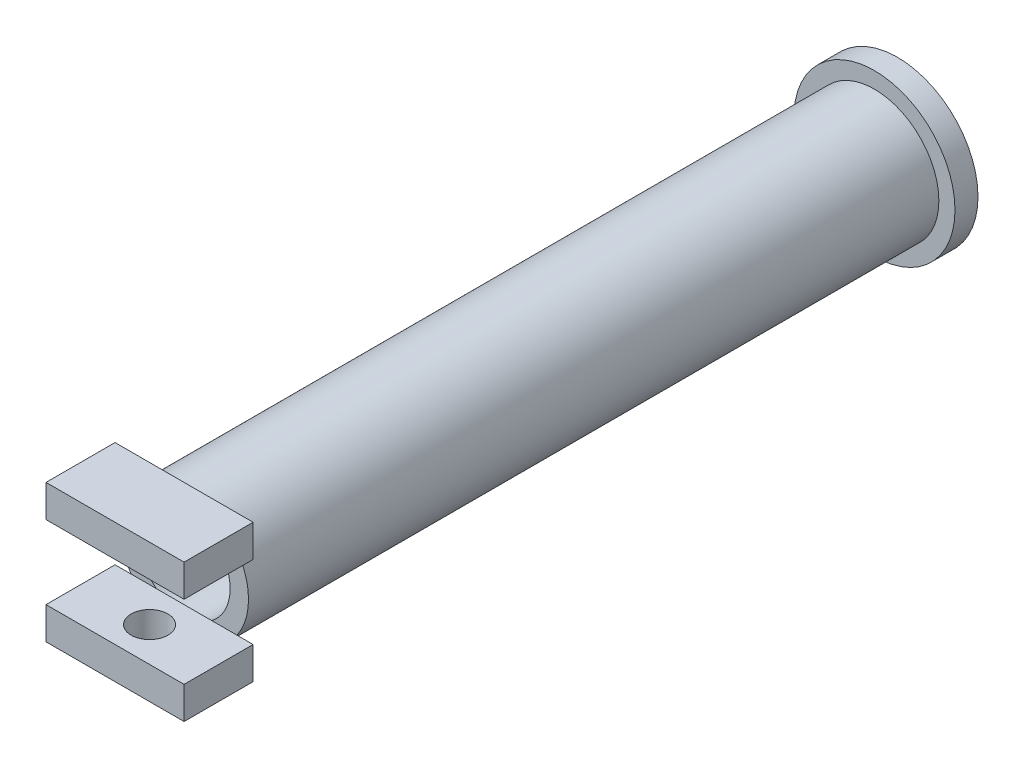
ISO-10303-21;
HEADER;
FILE_DESCRIPTION(('STEP AP214'),'2;1');
FILE_NAME('part.step','',(''),(''),'','','');
FILE_SCHEMA(('AUTOMOTIVE_DESIGN { 1 0 10303 214 1 1 1 1 }'));
ENDSEC;
DATA;
#1=APPLICATION_CONTEXT('core data for automotive mechanical design processes');
#2=APPLICATION_PROTOCOL_DEFINITION('international standard','automotive_design',2000,#1);
#3=PRODUCT_CONTEXT('',#1,'mechanical');
#4=PRODUCT('Part','Part','',(#3));
#5=PRODUCT_RELATED_PRODUCT_CATEGORY('part','',(#4));
#6=PRODUCT_DEFINITION_FORMATION('','',#4);
#7=PRODUCT_DEFINITION_CONTEXT('part definition',#1,'design');
#8=PRODUCT_DEFINITION('design','',#6,#7);
#9=PRODUCT_DEFINITION_SHAPE('','',#8);
#10=(LENGTH_UNIT() NAMED_UNIT(*) SI_UNIT(.MILLI.,.METRE.));
#11=(NAMED_UNIT(*) PLANE_ANGLE_UNIT() SI_UNIT($,.RADIAN.));
#12=(NAMED_UNIT(*) SI_UNIT($,.STERADIAN.) SOLID_ANGLE_UNIT());
#13=UNCERTAINTY_MEASURE_WITH_UNIT(LENGTH_MEASURE(1.E-05),#10,'distance_accuracy_value','');
#14=(GEOMETRIC_REPRESENTATION_CONTEXT(3) GLOBAL_UNCERTAINTY_ASSIGNED_CONTEXT((#13)) GLOBAL_UNIT_ASSIGNED_CONTEXT((#10,
#11,#12)) REPRESENTATION_CONTEXT('',''));
#15=CARTESIAN_POINT('',(0.,0.,0.));
#16=DIRECTION('',(0.,0.,1.));
#17=DIRECTION('',(1.,0.,0.));
#18=AXIS2_PLACEMENT_3D('',#15,#16,#17);
#19=CARTESIAN_POINT('',(0.,0.,170.));
#20=DIRECTION('',(0.,0.,-1.));
#21=DIRECTION('',(-1.,0.,0.));
#22=AXIS2_PLACEMENT_3D('',#19,#20,#21);
#23=PLANE('',#22);
#24=DIRECTION('',(-1.,0.,0.));
#25=VECTOR('',#24,1.);
#26=CARTESIAN_POINT('',(-15.,8.,170.));
#27=LINE('',#26,#25);
#28=CARTESIAN_POINT('',(15.,8.,170.));
#29=VERTEX_POINT('',#28);
#30=CARTESIAN_POINT('',(-15.,8.,170.));
#31=VERTEX_POINT('',#30);
#32=EDGE_CURVE('E133',#29,#31,#27,.T.);
#33=ORIENTED_EDGE('',*,*,#32,.F.);
#34=DIRECTION('',(0.,1.,0.));
#35=VECTOR('',#34,1.);
#36=CARTESIAN_POINT('',(15.,-15.,170.));
#37=LINE('',#36,#35);
#38=CARTESIAN_POINT('',(15.,15.,170.));
#39=VERTEX_POINT('',#38);
#40=EDGE_CURVE('E161',#29,#39,#37,.T.);
#41=ORIENTED_EDGE('',*,*,#40,.T.);
#42=DIRECTION('',(-1.,0.,0.));
#43=VECTOR('',#42,1.);
#44=CARTESIAN_POINT('',(-15.,15.,170.));
#45=LINE('',#44,#43);
#46=CARTESIAN_POINT('',(-15.,15.,170.));
#47=VERTEX_POINT('',#46);
#48=EDGE_CURVE('E288',#39,#47,#45,.T.);
#49=ORIENTED_EDGE('',*,*,#48,.T.);
#50=DIRECTION('',(0.,-1.,0.));
#51=VECTOR('',#50,1.);
#52=CARTESIAN_POINT('',(-15.,-15.,170.));
#53=LINE('',#52,#51);
#54=EDGE_CURVE('E290',#47,#31,#53,.T.);
#55=ORIENTED_EDGE('',*,*,#54,.T.);
#56=EDGE_LOOP('',(#33,#41,#49,#55));
#57=FACE_BOUND('',#56,.T.);
#58=ADVANCED_FACE('F39',(#57),#23,.F.);
#59=DIRECTION('',(1.,0.,0.));
#60=VECTOR('',#59,1.);
#61=CARTESIAN_POINT('',(-15.,-8.,170.));
#62=LINE('',#61,#60);
#63=CARTESIAN_POINT('',(-15.,-8.,170.));
#64=VERTEX_POINT('',#63);
#65=CARTESIAN_POINT('',(15.,-8.,170.));
#66=VERTEX_POINT('',#65);
#67=EDGE_CURVE('E267',#64,#66,#62,.T.);
#68=ORIENTED_EDGE('',*,*,#67,.F.);
#69=CARTESIAN_POINT('',(-15.,-15.,170.));
#70=VERTEX_POINT('',#69);
#71=EDGE_CURVE('E287',#64,#70,#53,.T.);
#72=ORIENTED_EDGE('',*,*,#71,.T.);
#73=DIRECTION('',(1.,0.,0.));
#74=VECTOR('',#73,1.);
#75=CARTESIAN_POINT('',(-15.,-15.,170.));
#76=LINE('',#75,#74);
#77=CARTESIAN_POINT('',(15.,-15.,170.));
#78=VERTEX_POINT('',#77);
#79=EDGE_CURVE('E171',#70,#78,#76,.T.);
#80=ORIENTED_EDGE('',*,*,#79,.T.);
#81=EDGE_CURVE('E284',#78,#66,#37,.T.);
#82=ORIENTED_EDGE('',*,*,#81,.T.);
#83=EDGE_LOOP('',(#68,#72,#80,#82));
#84=FACE_BOUND('',#83,.T.);
#85=ADVANCED_FACE('F213',(#84),#23,.F.);
#86=CARTESIAN_POINT('',(-15.,-15.,170.));
#87=DIRECTION('',(1.,0.,0.));
#88=DIRECTION('',(0.,0.,-1.));
#89=AXIS2_PLACEMENT_3D('',#86,#87,#88);
#90=PLANE('',#89);
#91=DIRECTION('',(0.,0.,1.));
#92=VECTOR('',#91,1.);
#93=CARTESIAN_POINT('',(-15.,-8.,155.));
#94=LINE('',#93,#92);
#95=CARTESIAN_POINT('',(-15.,-8.,155.));
#96=VERTEX_POINT('',#95);
#97=EDGE_CURVE('E140',#96,#64,#94,.T.);
#98=ORIENTED_EDGE('',*,*,#97,.F.);
#99=DIRECTION('',(0.,-1.,0.));
#100=VECTOR('',#99,1.);
#101=CARTESIAN_POINT('',(-15.,-15.,155.));
#102=LINE('',#101,#100);
#103=CARTESIAN_POINT('',(-15.,-15.,155.));
#104=VERTEX_POINT('',#103);
#105=EDGE_CURVE('E157',#96,#104,#102,.T.);
#106=ORIENTED_EDGE('',*,*,#105,.T.);
#107=DIRECTION('',(0.,0.,-1.));
#108=VECTOR('',#107,1.);
#109=CARTESIAN_POINT('',(-15.,-15.,170.));
#110=LINE('',#109,#108);
#111=EDGE_CURVE('E168',#70,#104,#110,.T.);
#112=ORIENTED_EDGE('',*,*,#111,.F.);
#113=ORIENTED_EDGE('',*,*,#71,.F.);
#114=EDGE_LOOP('',(#98,#106,#112,#113));
#115=FACE_BOUND('',#114,.T.);
#116=ADVANCED_FACE('F219',(#115),#90,.F.);
#117=CARTESIAN_POINT('',(15.,-15.,170.));
#118=DIRECTION('',(-1.,0.,0.));
#119=DIRECTION('',(0.,0.,1.));
#120=AXIS2_PLACEMENT_3D('',#117,#118,#119);
#121=PLANE('',#120);
#122=DIRECTION('',(0.,0.,1.));
#123=VECTOR('',#122,1.);
#124=CARTESIAN_POINT('',(15.,8.,155.));
#125=LINE('',#124,#123);
#126=CARTESIAN_POINT('',(15.,8.,155.));
#127=VERTEX_POINT('',#126);
#128=EDGE_CURVE('E136',#127,#29,#125,.T.);
#129=ORIENTED_EDGE('',*,*,#128,.F.);
#130=DIRECTION('',(0.,1.,0.));
#131=VECTOR('',#130,1.);
#132=CARTESIAN_POINT('',(15.,-15.,155.));
#133=LINE('',#132,#131);
#134=CARTESIAN_POINT('',(15.,15.,155.));
#135=VERTEX_POINT('',#134);
#136=EDGE_CURVE('E291',#127,#135,#133,.T.);
#137=ORIENTED_EDGE('',*,*,#136,.T.);
#138=DIRECTION('',(0.,0.,-1.));
#139=VECTOR('',#138,1.);
#140=CARTESIAN_POINT('',(15.,15.,170.));
#141=LINE('',#140,#139);
#142=EDGE_CURVE('E175',#39,#135,#141,.T.);
#143=ORIENTED_EDGE('',*,*,#142,.F.);
#144=ORIENTED_EDGE('',*,*,#40,.F.);
#145=EDGE_LOOP('',(#129,#137,#143,#144));
#146=FACE_BOUND('',#145,.T.);
#147=ADVANCED_FACE('F244',(#146),#121,.F.);
#148=CARTESIAN_POINT('',(0.,0.,155.));
#149=DIRECTION('',(0.,0.,-1.));
#150=DIRECTION('',(-1.,0.,0.));
#151=AXIS2_PLACEMENT_3D('',#148,#149,#150);
#152=PLANE('',#151);
#153=ORIENTED_EDGE('',*,*,#105,.F.);
#154=DIRECTION('',(1.,0.,0.));
#155=VECTOR('',#154,1.);
#156=CARTESIAN_POINT('',(-15.,-8.,155.));
#157=LINE('',#156,#155);
#158=CARTESIAN_POINT('',(-11.4891252930761,-8.,155.));
#159=VERTEX_POINT('',#158);
#160=EDGE_CURVE('E49',#96,#159,#157,.T.);
#161=ORIENTED_EDGE('',*,*,#160,.T.);
#162=CARTESIAN_POINT('',(0.,0.,155.));
#163=DIRECTION('',(0.,0.,1.));
#164=DIRECTION('',(1.,0.,0.));
#165=AXIS2_PLACEMENT_3D('',#162,#163,#164);
#166=CIRCLE('',#165,14.);
#167=CARTESIAN_POINT('',(11.4891252930761,-8.,155.));
#168=VERTEX_POINT('',#167);
#169=EDGE_CURVE('E315',#159,#168,#166,.T.);
#170=ORIENTED_EDGE('',*,*,#169,.T.);
#171=CARTESIAN_POINT('',(15.,-8.,155.));
#172=VERTEX_POINT('',#171);
#173=EDGE_CURVE('E11',#168,#172,#157,.T.);
#174=ORIENTED_EDGE('',*,*,#173,.T.);
#175=CARTESIAN_POINT('',(15.,-15.,155.));
#176=VERTEX_POINT('',#175);
#177=EDGE_CURVE('E292',#176,#172,#133,.T.);
#178=ORIENTED_EDGE('',*,*,#177,.F.);
#179=DIRECTION('',(1.,0.,0.));
#180=VECTOR('',#179,1.);
#181=CARTESIAN_POINT('',(-15.,-15.,155.));
#182=LINE('',#181,#180);
#183=EDGE_CURVE('E158',#104,#176,#182,.T.);
#184=ORIENTED_EDGE('',*,*,#183,.F.);
#185=EDGE_LOOP('',(#153,#161,#170,#174,#178,#184));
#186=FACE_BOUND('',#185,.T.);
#187=ADVANCED_FACE('F312',(#186),#152,.T.);
#188=ORIENTED_EDGE('',*,*,#136,.F.);
#189=DIRECTION('',(-1.,0.,0.));
#190=VECTOR('',#189,1.);
#191=CARTESIAN_POINT('',(-15.,8.,155.));
#192=LINE('',#191,#190);
#193=CARTESIAN_POINT('',(11.4891252930761,8.,155.));
#194=VERTEX_POINT('',#193);
#195=EDGE_CURVE('E65',#127,#194,#192,.T.);
#196=ORIENTED_EDGE('',*,*,#195,.T.);
#197=CARTESIAN_POINT('',(-11.4891252930761,8.,155.));
#198=VERTEX_POINT('',#197);
#199=EDGE_CURVE('E147',#194,#198,#166,.T.);
#200=ORIENTED_EDGE('',*,*,#199,.T.);
#201=CARTESIAN_POINT('',(-15.,8.,155.));
#202=VERTEX_POINT('',#201);
#203=EDGE_CURVE('E48',#198,#202,#192,.T.);
#204=ORIENTED_EDGE('',*,*,#203,.T.);
#205=CARTESIAN_POINT('',(-15.,15.,155.));
#206=VERTEX_POINT('',#205);
#207=EDGE_CURVE('E146',#206,#202,#102,.T.);
#208=ORIENTED_EDGE('',*,*,#207,.F.);
#209=DIRECTION('',(-1.,0.,0.));
#210=VECTOR('',#209,1.);
#211=CARTESIAN_POINT('',(-15.,15.,155.));
#212=LINE('',#211,#210);
#213=EDGE_CURVE('E162',#135,#206,#212,.T.);
#214=ORIENTED_EDGE('',*,*,#213,.F.);
#215=EDGE_LOOP('',(#188,#196,#200,#204,#208,#214));
#216=FACE_BOUND('',#215,.T.);
#217=ADVANCED_FACE('F148',(#216),#152,.T.);
#218=CARTESIAN_POINT('',(0.,0.,5.));
#219=DIRECTION('',(0.,0.,-1.));
#220=DIRECTION('',(-1.,0.,0.));
#221=AXIS2_PLACEMENT_3D('',#218,#219,#220);
#222=CYLINDRICAL_SURFACE('',#221,17.5);
#223=CARTESIAN_POINT('',(0.,0.,5.));
#224=DIRECTION('',(0.,0.,1.));
#225=DIRECTION('',(1.,0.,0.));
#226=AXIS2_PLACEMENT_3D('',#223,#224,#225);
#227=CIRCLE('',#226,17.5);
#228=CARTESIAN_POINT('',(17.5,0.,5.));
#229=VERTEX_POINT('',#228);
#230=EDGE_CURVE('E151',#229,#229,#227,.T.);
#231=ORIENTED_EDGE('',*,*,#230,.F.);
#232=EDGE_LOOP('',(#231));
#233=FACE_BOUND('',#232,.T.);
#234=CARTESIAN_POINT('',(0.,0.,0.));
#235=DIRECTION('',(0.,0.,1.));
#236=DIRECTION('',(1.,0.,0.));
#237=AXIS2_PLACEMENT_3D('',#234,#235,#236);
#238=CIRCLE('',#237,17.5);
#239=CARTESIAN_POINT('',(17.5,0.,0.));
#240=VERTEX_POINT('',#239);
#241=EDGE_CURVE('E194',#240,#240,#238,.T.);
#242=ORIENTED_EDGE('',*,*,#241,.T.);
#243=EDGE_LOOP('',(#242));
#244=FACE_BOUND('',#243,.T.);
#245=ADVANCED_FACE('F41',(#233,#244),#222,.T.);
#246=CARTESIAN_POINT('',(0.,0.,5.));
#247=DIRECTION('',(0.,0.,1.));
#248=DIRECTION('',(1.,0.,0.));
#249=AXIS2_PLACEMENT_3D('',#246,#247,#248);
#250=PLANE('',#249);
#251=CARTESIAN_POINT('',(0.,0.,5.));
#252=DIRECTION('',(0.,0.,1.));
#253=DIRECTION('',(1.,0.,0.));
#254=AXIS2_PLACEMENT_3D('',#251,#252,#253);
#255=CIRCLE('',#254,14.);
#256=CARTESIAN_POINT('',(14.,0.,5.));
#257=VERTEX_POINT('',#256);
#258=EDGE_CURVE('E189',#257,#257,#255,.F.);
#259=ORIENTED_EDGE('',*,*,#258,.T.);
#260=EDGE_LOOP('',(#259));
#261=FACE_BOUND('',#260,.T.);
#262=ORIENTED_EDGE('',*,*,#230,.T.);
#263=EDGE_LOOP('',(#262));
#264=FACE_BOUND('',#263,.T.);
#265=ADVANCED_FACE('F203',(#261,#264),#250,.T.);
#266=CARTESIAN_POINT('',(0.,0.,0.));
#267=DIRECTION('',(0.,0.,1.));
#268=DIRECTION('',(1.,0.,0.));
#269=AXIS2_PLACEMENT_3D('',#266,#267,#268);
#270=PLANE('',#269);
#271=ORIENTED_EDGE('',*,*,#241,.F.);
#272=EDGE_LOOP('',(#271));
#273=FACE_BOUND('',#272,.T.);
#274=ADVANCED_FACE('F196',(#273),#270,.F.);
#275=CARTESIAN_POINT('',(0.,0.,155.));
#276=DIRECTION('',(0.,0.,-1.));
#277=DIRECTION('',(-1.,0.,0.));
#278=AXIS2_PLACEMENT_3D('',#275,#276,#277);
#279=CYLINDRICAL_SURFACE('',#278,14.);
#280=ORIENTED_EDGE('',*,*,#258,.F.);
#281=EDGE_LOOP('',(#280));
#282=FACE_BOUND('',#281,.T.);
#283=ORIENTED_EDGE('',*,*,#199,.F.);
#284=EDGE_CURVE('E185',#168,#194,#166,.T.);
#285=ORIENTED_EDGE('',*,*,#284,.F.);
#286=ORIENTED_EDGE('',*,*,#169,.F.);
#287=EDGE_CURVE('E188',#198,#159,#166,.T.);
#288=ORIENTED_EDGE('',*,*,#287,.F.);
#289=EDGE_LOOP('',(#283,#285,#286,#288));
#290=FACE_BOUND('',#289,.T.);
#291=ADVANCED_FACE('F199',(#282,#290),#279,.T.);
#292=CARTESIAN_POINT('',(-15.,-15.,170.));
#293=DIRECTION('',(0.,1.,0.));
#294=DIRECTION('',(0.,0.,1.));
#295=AXIS2_PLACEMENT_3D('',#292,#293,#294);
#296=PLANE('',#295);
#297=CARTESIAN_POINT('',(0.,-15.,162.5));
#298=DIRECTION('',(0.,1.,0.));
#299=DIRECTION('',(0.,0.,1.));
#300=AXIS2_PLACEMENT_3D('',#297,#298,#299);
#301=CIRCLE('',#300,4.);
#302=CARTESIAN_POINT('',(0.,-15.,166.5));
#303=VERTEX_POINT('',#302);
#304=EDGE_CURVE('E275',#303,#303,#301,.T.);
#305=ORIENTED_EDGE('',*,*,#304,.T.);
#306=EDGE_LOOP('',(#305));
#307=FACE_BOUND('',#306,.T.);
#308=ORIENTED_EDGE('',*,*,#183,.T.);
#309=DIRECTION('',(0.,0.,-1.));
#310=VECTOR('',#309,1.);
#311=CARTESIAN_POINT('',(15.,-15.,170.));
#312=LINE('',#311,#310);
#313=EDGE_CURVE('E170',#78,#176,#312,.T.);
#314=ORIENTED_EDGE('',*,*,#313,.F.);
#315=ORIENTED_EDGE('',*,*,#79,.F.);
#316=ORIENTED_EDGE('',*,*,#111,.T.);
#317=EDGE_LOOP('',(#308,#314,#315,#316));
#318=FACE_BOUND('',#317,.T.);
#319=ADVANCED_FACE('F210',(#307,#318),#296,.F.);
#320=ORIENTED_EDGE('',*,*,#207,.T.);
#321=DIRECTION('',(0.,0.,1.));
#322=VECTOR('',#321,1.);
#323=CARTESIAN_POINT('',(-15.,8.,155.));
#324=LINE('',#323,#322);
#325=EDGE_CURVE('E128',#202,#31,#324,.T.);
#326=ORIENTED_EDGE('',*,*,#325,.T.);
#327=ORIENTED_EDGE('',*,*,#54,.F.);
#328=DIRECTION('',(0.,0.,-1.));
#329=VECTOR('',#328,1.);
#330=CARTESIAN_POINT('',(-15.,15.,170.));
#331=LINE('',#330,#329);
#332=EDGE_CURVE('E160',#47,#206,#331,.T.);
#333=ORIENTED_EDGE('',*,*,#332,.T.);
#334=EDGE_LOOP('',(#320,#326,#327,#333));
#335=FACE_BOUND('',#334,.T.);
#336=ADVANCED_FACE('F154',(#335),#90,.F.);
#337=CARTESIAN_POINT('',(-15.,15.,170.));
#338=DIRECTION('',(0.,-1.,0.));
#339=DIRECTION('',(0.,0.,-1.));
#340=AXIS2_PLACEMENT_3D('',#337,#338,#339);
#341=PLANE('',#340);
#342=ORIENTED_EDGE('',*,*,#213,.T.);
#343=ORIENTED_EDGE('',*,*,#332,.F.);
#344=ORIENTED_EDGE('',*,*,#48,.F.);
#345=ORIENTED_EDGE('',*,*,#142,.T.);
#346=EDGE_LOOP('',(#342,#343,#344,#345));
#347=FACE_BOUND('',#346,.T.);
#348=ADVANCED_FACE('F231',(#347),#341,.F.);
#349=ORIENTED_EDGE('',*,*,#177,.T.);
#350=DIRECTION('',(0.,0.,1.));
#351=VECTOR('',#350,1.);
#352=CARTESIAN_POINT('',(15.,-8.,155.));
#353=LINE('',#352,#351);
#354=EDGE_CURVE('E279',#172,#66,#353,.T.);
#355=ORIENTED_EDGE('',*,*,#354,.T.);
#356=ORIENTED_EDGE('',*,*,#81,.F.);
#357=ORIENTED_EDGE('',*,*,#313,.T.);
#358=EDGE_LOOP('',(#349,#355,#356,#357));
#359=FACE_BOUND('',#358,.T.);
#360=ADVANCED_FACE('F240',(#359),#121,.F.);
#361=CARTESIAN_POINT('',(0.,0.,155.));
#362=DIRECTION('',(0.,0.,-1.));
#363=DIRECTION('',(-1.,0.,0.));
#364=AXIS2_PLACEMENT_3D('',#361,#362,#363);
#365=PLANE('',#364);
#366=CARTESIAN_POINT('',(-6.,8.,155.));
#367=VERTEX_POINT('',#366);
#368=EDGE_CURVE('E59',#367,#198,#192,.T.);
#369=ORIENTED_EDGE('',*,*,#368,.T.);
#370=ORIENTED_EDGE('',*,*,#287,.T.);
#371=CARTESIAN_POINT('',(-6.,-8.,155.));
#372=VERTEX_POINT('',#371);
#373=EDGE_CURVE('E51',#159,#372,#157,.T.);
#374=ORIENTED_EDGE('',*,*,#373,.T.);
#375=CARTESIAN_POINT('',(0.,0.,155.));
#376=DIRECTION('',(0.,0.,1.));
#377=DIRECTION('',(1.,0.,0.));
#378=AXIS2_PLACEMENT_3D('',#375,#376,#377);
#379=CIRCLE('',#378,10.);
#380=EDGE_CURVE('E262',#367,#372,#379,.T.);
#381=ORIENTED_EDGE('',*,*,#380,.F.);
#382=EDGE_LOOP('',(#369,#370,#374,#381));
#383=FACE_BOUND('',#382,.T.);
#384=ADVANCED_FACE('F241',(#383),#365,.F.);
#385=CARTESIAN_POINT('',(6.,-8.,155.));
#386=VERTEX_POINT('',#385);
#387=EDGE_CURVE('E271',#386,#168,#157,.T.);
#388=ORIENTED_EDGE('',*,*,#387,.T.);
#389=ORIENTED_EDGE('',*,*,#284,.T.);
#390=CARTESIAN_POINT('',(6.,8.,155.));
#391=VERTEX_POINT('',#390);
#392=EDGE_CURVE('E153',#194,#391,#192,.T.);
#393=ORIENTED_EDGE('',*,*,#392,.T.);
#394=EDGE_CURVE('E186',#386,#391,#379,.T.);
#395=ORIENTED_EDGE('',*,*,#394,.F.);
#396=EDGE_LOOP('',(#388,#389,#393,#395));
#397=FACE_BOUND('',#396,.T.);
#398=ADVANCED_FACE('F307',(#397),#365,.F.);
#399=CARTESIAN_POINT('',(-15.,-8.,155.));
#400=DIRECTION('',(0.,-1.,0.));
#401=DIRECTION('',(0.,0.,-1.));
#402=AXIS2_PLACEMENT_3D('',#399,#400,#401);
#403=PLANE('',#402);
#404=CARTESIAN_POINT('',(0.,-8.,162.5));
#405=DIRECTION('',(0.,-1.,0.));
#406=DIRECTION('',(0.,0.,-1.));
#407=AXIS2_PLACEMENT_3D('',#404,#405,#406);
#408=CIRCLE('',#407,4.);
#409=CARTESIAN_POINT('',(0.,-8.,158.5));
#410=VERTEX_POINT('',#409);
#411=EDGE_CURVE('E499',#410,#410,#408,.T.);
#412=ORIENTED_EDGE('',*,*,#411,.T.);
#413=EDGE_LOOP('',(#412));
#414=FACE_BOUND('',#413,.T.);
#415=ORIENTED_EDGE('',*,*,#67,.T.);
#416=ORIENTED_EDGE('',*,*,#354,.F.);
#417=ORIENTED_EDGE('',*,*,#173,.F.);
#418=ORIENTED_EDGE('',*,*,#387,.F.);
#419=EDGE_CURVE('E298',#372,#386,#157,.T.);
#420=ORIENTED_EDGE('',*,*,#419,.F.);
#421=ORIENTED_EDGE('',*,*,#373,.F.);
#422=ORIENTED_EDGE('',*,*,#160,.F.);
#423=ORIENTED_EDGE('',*,*,#97,.T.);
#424=EDGE_LOOP('',(#415,#416,#417,#418,#420,#421,#422,#423));
#425=FACE_BOUND('',#424,.T.);
#426=ADVANCED_FACE('F320',(#414,#425),#403,.F.);
#427=CARTESIAN_POINT('',(-15.,8.,155.));
#428=DIRECTION('',(0.,1.,0.));
#429=DIRECTION('',(0.,0.,1.));
#430=AXIS2_PLACEMENT_3D('',#427,#428,#429);
#431=PLANE('',#430);
#432=CARTESIAN_POINT('',(0.,8.,162.5));
#433=DIRECTION('',(0.,1.,0.));
#434=DIRECTION('',(0.,0.,1.));
#435=AXIS2_PLACEMENT_3D('',#432,#433,#434);
#436=CIRCLE('',#435,4.);
#437=CARTESIAN_POINT('',(0.,8.,166.5));
#438=VERTEX_POINT('',#437);
#439=EDGE_CURVE('E43',#438,#438,#436,.T.);
#440=ORIENTED_EDGE('',*,*,#439,.T.);
#441=EDGE_LOOP('',(#440));
#442=FACE_BOUND('',#441,.T.);
#443=ORIENTED_EDGE('',*,*,#32,.T.);
#444=ORIENTED_EDGE('',*,*,#325,.F.);
#445=ORIENTED_EDGE('',*,*,#203,.F.);
#446=ORIENTED_EDGE('',*,*,#368,.F.);
#447=EDGE_CURVE('E270',#391,#367,#192,.T.);
#448=ORIENTED_EDGE('',*,*,#447,.F.);
#449=ORIENTED_EDGE('',*,*,#392,.F.);
#450=ORIENTED_EDGE('',*,*,#195,.F.);
#451=ORIENTED_EDGE('',*,*,#128,.T.);
#452=EDGE_LOOP('',(#443,#444,#445,#446,#448,#449,#450,#451));
#453=FACE_BOUND('',#452,.T.);
#454=ADVANCED_FACE('F132',(#442,#453),#431,.F.);
#455=EDGE_CURVE('E177',#372,#386,#379,.T.);
#456=ORIENTED_EDGE('',*,*,#455,.F.);
#457=ORIENTED_EDGE('',*,*,#419,.T.);
#458=EDGE_LOOP('',(#456,#457));
#459=FACE_BOUND('',#458,.T.);
#460=ADVANCED_FACE('F223',(#459),#152,.T.);
#461=EDGE_CURVE('E181',#391,#367,#379,.T.);
#462=ORIENTED_EDGE('',*,*,#461,.F.);
#463=ORIENTED_EDGE('',*,*,#447,.T.);
#464=EDGE_LOOP('',(#462,#463));
#465=FACE_BOUND('',#464,.T.);
#466=ADVANCED_FACE('F229',(#465),#152,.T.);
#467=CARTESIAN_POINT('',(0.,0.,5.));
#468=DIRECTION('',(0.,0.,1.));
#469=DIRECTION('',(1.,0.,0.));
#470=AXIS2_PLACEMENT_3D('',#467,#468,#469);
#471=PLANE('',#470);
#472=CARTESIAN_POINT('',(0.,0.,5.));
#473=DIRECTION('',(0.,0.,1.));
#474=DIRECTION('',(1.,0.,0.));
#475=AXIS2_PLACEMENT_3D('',#472,#473,#474);
#476=CIRCLE('',#475,10.);
#477=CARTESIAN_POINT('',(10.,0.,5.));
#478=VERTEX_POINT('',#477);
#479=EDGE_CURVE('E180',#478,#478,#476,.T.);
#480=ORIENTED_EDGE('',*,*,#479,.T.);
#481=EDGE_LOOP('',(#480));
#482=FACE_BOUND('',#481,.T.);
#483=ADVANCED_FACE('F243',(#482),#471,.T.);
#484=CARTESIAN_POINT('',(0.,0.,5.));
#485=DIRECTION('',(0.,0.,1.));
#486=DIRECTION('',(1.,0.,0.));
#487=AXIS2_PLACEMENT_3D('',#484,#485,#486);
#488=CYLINDRICAL_SURFACE('',#487,10.);
#489=ORIENTED_EDGE('',*,*,#479,.F.);
#490=EDGE_LOOP('',(#489));
#491=FACE_BOUND('',#490,.T.);
#492=ORIENTED_EDGE('',*,*,#461,.T.);
#493=ORIENTED_EDGE('',*,*,#380,.T.);
#494=ORIENTED_EDGE('',*,*,#455,.T.);
#495=ORIENTED_EDGE('',*,*,#394,.T.);
#496=EDGE_LOOP('',(#492,#493,#494,#495));
#497=FACE_BOUND('',#496,.T.);
#498=ADVANCED_FACE('F248',(#491,#497),#488,.F.);
#499=CARTESIAN_POINT('',(0.,11.5,162.5));
#500=DIRECTION('',(0.,1.,0.));
#501=DIRECTION('',(0.,0.,1.));
#502=AXIS2_PLACEMENT_3D('',#499,#500,#501);
#503=PLANE('',#502);
#504=CARTESIAN_POINT('',(0.,11.5,162.5));
#505=DIRECTION('',(0.,1.,0.));
#506=DIRECTION('',(0.,0.,1.));
#507=AXIS2_PLACEMENT_3D('',#504,#505,#506);
#508=CIRCLE('',#507,4.);
#509=CARTESIAN_POINT('',(0.,11.5,166.5));
#510=VERTEX_POINT('',#509);
#511=EDGE_CURVE('E502',#510,#510,#508,.T.);
#512=ORIENTED_EDGE('',*,*,#511,.F.);
#513=EDGE_LOOP('',(#512));
#514=FACE_BOUND('',#513,.T.);
#515=ADVANCED_FACE('F250',(#514),#503,.F.);
#516=CARTESIAN_POINT('',(0.,-18.5,162.5));
#517=DIRECTION('',(0.,1.,0.));
#518=DIRECTION('',(0.,0.,1.));
#519=AXIS2_PLACEMENT_3D('',#516,#517,#518);
#520=CYLINDRICAL_SURFACE('',#519,4.);
#521=ORIENTED_EDGE('',*,*,#511,.T.);
#522=EDGE_LOOP('',(#521));
#523=FACE_BOUND('',#522,.T.);
#524=ORIENTED_EDGE('',*,*,#439,.F.);
#525=EDGE_LOOP('',(#524));
#526=FACE_BOUND('',#525,.T.);
#527=ADVANCED_FACE('F254',(#523,#526),#520,.F.);
#528=ORIENTED_EDGE('',*,*,#411,.F.);
#529=EDGE_LOOP('',(#528));
#530=FACE_BOUND('',#529,.T.);
#531=ORIENTED_EDGE('',*,*,#304,.F.);
#532=EDGE_LOOP('',(#531));
#533=FACE_BOUND('',#532,.T.);
#534=ADVANCED_FACE('F478',(#530,#533),#520,.F.);
#535=CLOSED_SHELL('',(#58,#85,#116,#147,#187,#217,#245,#265,#274,#291,#319,#336,#348,#360,#384,
#398,#426,#454,#460,#466,#483,#498,#515,#527,#534));
#536=MANIFOLD_SOLID_BREP('B2',#535);
#537=ADVANCED_BREP_SHAPE_REPRESENTATION('',(#18,#536),#14);
#538=SHAPE_DEFINITION_REPRESENTATION(#9,#537);
ENDSEC;
END-ISO-10303-21;
